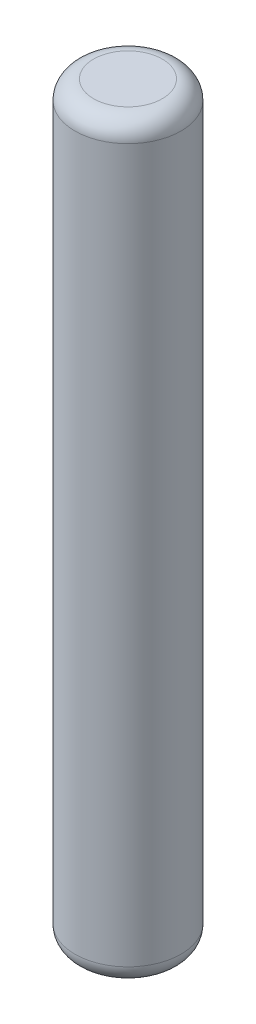
ISO-10303-21;
HEADER;
FILE_DESCRIPTION(('STEP AP214'),'2;1');
FILE_NAME('part.step','',(''),(''),'','','');
FILE_SCHEMA(('AUTOMOTIVE_DESIGN { 1 0 10303 214 1 1 1 1 }'));
ENDSEC;
DATA;
#1=APPLICATION_CONTEXT('core data for automotive mechanical design processes');
#2=APPLICATION_PROTOCOL_DEFINITION('international standard','automotive_design',2000,#1);
#3=PRODUCT_CONTEXT('',#1,'mechanical');
#4=PRODUCT('Part','Part','',(#3));
#5=PRODUCT_RELATED_PRODUCT_CATEGORY('part','',(#4));
#6=PRODUCT_DEFINITION_FORMATION('','',#4);
#7=PRODUCT_DEFINITION_CONTEXT('part definition',#1,'design');
#8=PRODUCT_DEFINITION('design','',#6,#7);
#9=PRODUCT_DEFINITION_SHAPE('','',#8);
#10=(LENGTH_UNIT() NAMED_UNIT(*) SI_UNIT(.MILLI.,.METRE.));
#11=(NAMED_UNIT(*) PLANE_ANGLE_UNIT() SI_UNIT($,.RADIAN.));
#12=(NAMED_UNIT(*) SI_UNIT($,.STERADIAN.) SOLID_ANGLE_UNIT());
#13=UNCERTAINTY_MEASURE_WITH_UNIT(LENGTH_MEASURE(1.E-05),#10,'distance_accuracy_value','');
#14=(GEOMETRIC_REPRESENTATION_CONTEXT(3) GLOBAL_UNCERTAINTY_ASSIGNED_CONTEXT((#13)) GLOBAL_UNIT_ASSIGNED_CONTEXT((#10,
#11,#12)) REPRESENTATION_CONTEXT('',''));
#15=CARTESIAN_POINT('',(0.,0.,0.));
#16=DIRECTION('',(0.,0.,1.));
#17=DIRECTION('',(1.,0.,0.));
#18=AXIS2_PLACEMENT_3D('',#15,#16,#17);
#19=CARTESIAN_POINT('',(0.,40.18,0.));
#20=DIRECTION('',(0.,-1.,0.));
#21=DIRECTION('',(0.,0.,-1.));
#22=AXIS2_PLACEMENT_3D('',#19,#20,#21);
#23=CYLINDRICAL_SURFACE('',#22,2.84);
#24=CARTESIAN_POINT('',(0.,1.,0.));
#25=DIRECTION('',(0.,1.,0.));
#26=DIRECTION('',(0.,0.,1.));
#27=AXIS2_PLACEMENT_3D('',#24,#25,#26);
#28=CIRCLE('',#27,2.84);
#29=CARTESIAN_POINT('',(0.,1.,2.84));
#30=VERTEX_POINT('',#29);
#31=EDGE_CURVE('E42',#30,#30,#28,.T.);
#32=ORIENTED_EDGE('',*,*,#31,.T.);
#33=EDGE_LOOP('',(#32));
#34=FACE_BOUND('',#33,.T.);
#35=CARTESIAN_POINT('',(0.,39.18,0.));
#36=DIRECTION('',(0.,1.,0.));
#37=DIRECTION('',(0.,0.,1.));
#38=AXIS2_PLACEMENT_3D('',#35,#36,#37);
#39=CIRCLE('',#38,2.84);
#40=CARTESIAN_POINT('',(0.,39.18,2.84));
#41=VERTEX_POINT('',#40);
#42=EDGE_CURVE('E46',#41,#41,#39,.F.);
#43=ORIENTED_EDGE('',*,*,#42,.T.);
#44=EDGE_LOOP('',(#43));
#45=FACE_BOUND('',#44,.T.);
#46=ADVANCED_FACE('F35',(#34,#45),#23,.T.);
#47=CARTESIAN_POINT('',(0.,40.18,0.));
#48=DIRECTION('',(0.,1.,0.));
#49=DIRECTION('',(0.,0.,1.));
#50=AXIS2_PLACEMENT_3D('',#47,#48,#49);
#51=PLANE('',#50);
#52=CARTESIAN_POINT('',(0.,40.18,0.));
#53=DIRECTION('',(0.,1.,0.));
#54=DIRECTION('',(0.,0.,1.));
#55=AXIS2_PLACEMENT_3D('',#52,#53,#54);
#56=CIRCLE('',#55,1.84);
#57=CARTESIAN_POINT('',(0.,40.18,1.84));
#58=VERTEX_POINT('',#57);
#59=EDGE_CURVE('E50',#58,#58,#56,.T.);
#60=ORIENTED_EDGE('',*,*,#59,.T.);
#61=EDGE_LOOP('',(#60));
#62=FACE_BOUND('',#61,.T.);
#63=ADVANCED_FACE('F56',(#62),#51,.T.);
#64=CARTESIAN_POINT('',(0.,0.,0.));
#65=DIRECTION('',(0.,1.,0.));
#66=DIRECTION('',(0.,0.,1.));
#67=AXIS2_PLACEMENT_3D('',#64,#65,#66);
#68=PLANE('',#67);
#69=CARTESIAN_POINT('',(0.,0.,0.));
#70=DIRECTION('',(0.,1.,0.));
#71=DIRECTION('',(0.,0.,1.));
#72=AXIS2_PLACEMENT_3D('',#69,#70,#71);
#73=CIRCLE('',#72,1.84);
#74=CARTESIAN_POINT('',(0.,0.,1.84));
#75=VERTEX_POINT('',#74);
#76=EDGE_CURVE('E10',#75,#75,#73,.F.);
#77=ORIENTED_EDGE('',*,*,#76,.T.);
#78=EDGE_LOOP('',(#77));
#79=FACE_BOUND('',#78,.T.);
#80=ADVANCED_FACE('F60',(#79),#68,.F.);
#81=CARTESIAN_POINT('',(0.,39.18,0.));
#82=DIRECTION('',(0.,1.,0.));
#83=DIRECTION('',(0.,0.,1.));
#84=AXIS2_PLACEMENT_3D('',#81,#82,#83);
#85=TOROIDAL_SURFACE('',#84,1.84,1.);
#86=ORIENTED_EDGE('',*,*,#42,.F.);
#87=EDGE_LOOP('',(#86));
#88=FACE_BOUND('',#87,.T.);
#89=ORIENTED_EDGE('',*,*,#59,.F.);
#90=EDGE_LOOP('',(#89));
#91=FACE_BOUND('',#90,.T.);
#92=ADVANCED_FACE('F58',(#88,#91),#85,.T.);
#93=CARTESIAN_POINT('',(0.,1.,0.));
#94=DIRECTION('',(0.,1.,0.));
#95=DIRECTION('',(0.,0.,1.));
#96=AXIS2_PLACEMENT_3D('',#93,#94,#95);
#97=TOROIDAL_SURFACE('',#96,1.84,1.);
#98=ORIENTED_EDGE('',*,*,#76,.F.);
#99=EDGE_LOOP('',(#98));
#100=FACE_BOUND('',#99,.T.);
#101=ORIENTED_EDGE('',*,*,#31,.F.);
#102=EDGE_LOOP('',(#101));
#103=FACE_BOUND('',#102,.T.);
#104=ADVANCED_FACE('F37',(#100,#103),#97,.T.);
#105=CLOSED_SHELL('',(#46,#63,#80,#92,#104));
#106=MANIFOLD_SOLID_BREP('B2',#105);
#107=ADVANCED_BREP_SHAPE_REPRESENTATION('',(#18,#106),#14);
#108=SHAPE_DEFINITION_REPRESENTATION(#9,#107);
ENDSEC;
END-ISO-10303-21;
